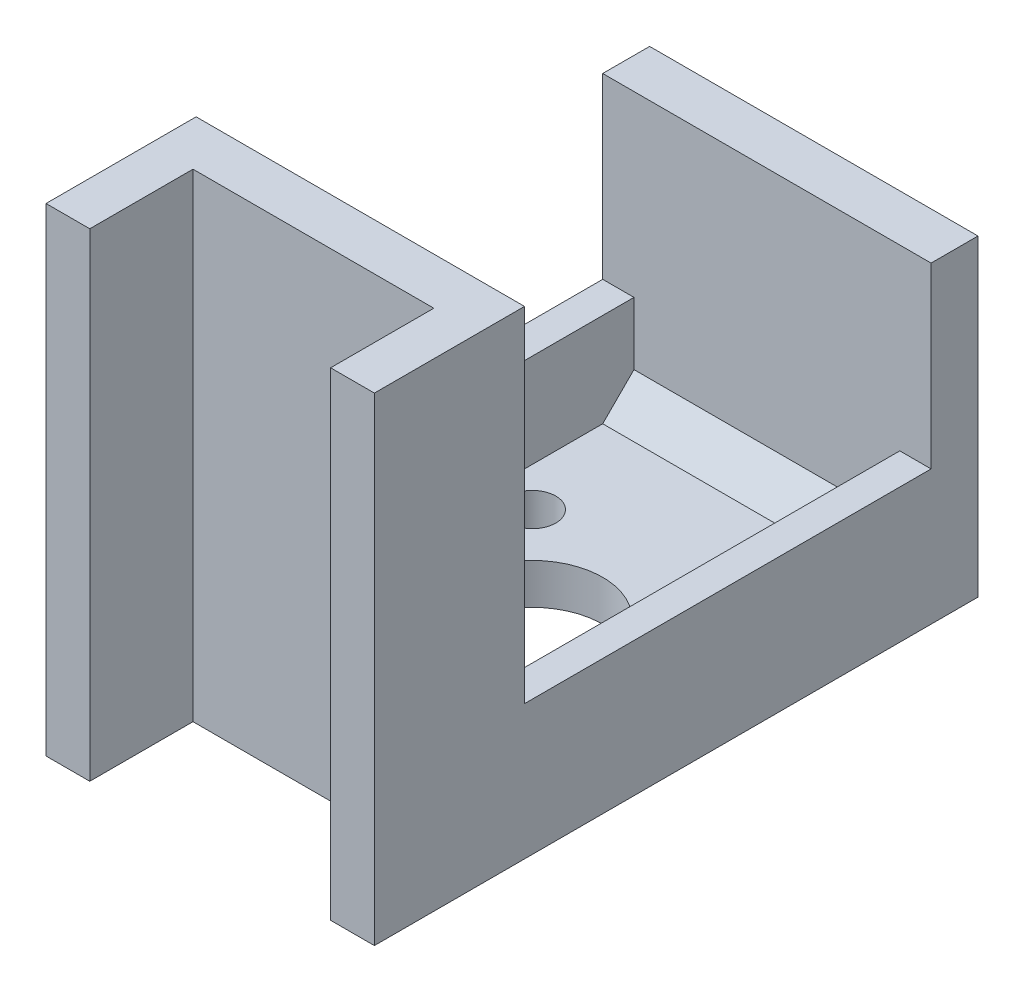
ISO-10303-21;
HEADER;
FILE_DESCRIPTION(('STEP AP214'),'2;1');
FILE_NAME('part.step','',(''),(''),'','','');
FILE_SCHEMA(('AUTOMOTIVE_DESIGN { 1 0 10303 214 1 1 1 1 }'));
ENDSEC;
DATA;
#1=APPLICATION_CONTEXT('core data for automotive mechanical design processes');
#2=APPLICATION_PROTOCOL_DEFINITION('international standard','automotive_design',2000,#1);
#3=PRODUCT_CONTEXT('',#1,'mechanical');
#4=PRODUCT('Part','Part','',(#3));
#5=PRODUCT_RELATED_PRODUCT_CATEGORY('part','',(#4));
#6=PRODUCT_DEFINITION_FORMATION('','',#4);
#7=PRODUCT_DEFINITION_CONTEXT('part definition',#1,'design');
#8=PRODUCT_DEFINITION('design','',#6,#7);
#9=PRODUCT_DEFINITION_SHAPE('','',#8);
#10=(LENGTH_UNIT() NAMED_UNIT(*) SI_UNIT(.MILLI.,.METRE.));
#11=(NAMED_UNIT(*) PLANE_ANGLE_UNIT() SI_UNIT($,.RADIAN.));
#12=(NAMED_UNIT(*) SI_UNIT($,.STERADIAN.) SOLID_ANGLE_UNIT());
#13=UNCERTAINTY_MEASURE_WITH_UNIT(LENGTH_MEASURE(1.E-05),#10,'distance_accuracy_value','');
#14=(GEOMETRIC_REPRESENTATION_CONTEXT(3) GLOBAL_UNCERTAINTY_ASSIGNED_CONTEXT((#13)) GLOBAL_UNIT_ASSIGNED_CONTEXT((#10,
#11,#12)) REPRESENTATION_CONTEXT('',''));
#15=CARTESIAN_POINT('',(0.,0.,0.));
#16=DIRECTION('',(0.,0.,1.));
#17=DIRECTION('',(1.,0.,0.));
#18=AXIS2_PLACEMENT_3D('',#15,#16,#17);
#19=CARTESIAN_POINT('',(0.,1.3,0.));
#20=DIRECTION('',(0.,1.,0.));
#21=DIRECTION('',(0.,0.,1.));
#22=AXIS2_PLACEMENT_3D('',#19,#20,#21);
#23=PLANE('',#22);
#24=CARTESIAN_POINT('',(3.,1.3,3.));
#25=DIRECTION('',(0.,1.,0.));
#26=DIRECTION('',(0.,0.,1.));
#27=AXIS2_PLACEMENT_3D('',#24,#25,#26);
#28=CIRCLE('',#27,0.75);
#29=CARTESIAN_POINT('',(3.,1.3,3.75));
#30=VERTEX_POINT('',#29);
#31=EDGE_CURVE('E284',#30,#30,#28,.T.);
#32=ORIENTED_EDGE('',*,*,#31,.F.);
#33=EDGE_LOOP('',(#32));
#34=FACE_BOUND('',#33,.T.);
#35=CARTESIAN_POINT('',(3.,1.3,-3.));
#36=DIRECTION('',(0.,1.,0.));
#37=DIRECTION('',(0.,0.,1.));
#38=AXIS2_PLACEMENT_3D('',#35,#36,#37);
#39=CIRCLE('',#38,0.75);
#40=CARTESIAN_POINT('',(3.,1.3,-2.25));
#41=VERTEX_POINT('',#40);
#42=EDGE_CURVE('E296',#41,#41,#39,.T.);
#43=ORIENTED_EDGE('',*,*,#42,.F.);
#44=EDGE_LOOP('',(#43));
#45=FACE_BOUND('',#44,.T.);
#46=CARTESIAN_POINT('',(-3.,1.3,-3.));
#47=DIRECTION('',(0.,1.,0.));
#48=DIRECTION('',(0.,0.,1.));
#49=AXIS2_PLACEMENT_3D('',#46,#47,#48);
#50=CIRCLE('',#49,0.75);
#51=CARTESIAN_POINT('',(-3.,1.3,-2.25));
#52=VERTEX_POINT('',#51);
#53=EDGE_CURVE('E302',#52,#52,#50,.T.);
#54=ORIENTED_EDGE('',*,*,#53,.F.);
#55=EDGE_LOOP('',(#54));
#56=FACE_BOUND('',#55,.T.);
#57=CARTESIAN_POINT('',(-3.,1.3,3.));
#58=DIRECTION('',(0.,1.,0.));
#59=DIRECTION('',(0.,0.,1.));
#60=AXIS2_PLACEMENT_3D('',#57,#58,#59);
#61=CIRCLE('',#60,0.75);
#62=CARTESIAN_POINT('',(-3.,1.3,3.75));
#63=VERTEX_POINT('',#62);
#64=EDGE_CURVE('E290',#63,#63,#61,.T.);
#65=ORIENTED_EDGE('',*,*,#64,.F.);
#66=EDGE_LOOP('',(#65));
#67=FACE_BOUND('',#66,.T.);
#68=CARTESIAN_POINT('',(0.,1.3,0.));
#69=DIRECTION('',(0.,1.,0.));
#70=DIRECTION('',(0.,0.,1.));
#71=AXIS2_PLACEMENT_3D('',#68,#69,#70);
#72=CIRCLE('',#71,2.25);
#73=CARTESIAN_POINT('',(0.,1.3,2.25));
#74=VERTEX_POINT('',#73);
#75=EDGE_CURVE('E278',#74,#74,#72,.T.);
#76=ORIENTED_EDGE('',*,*,#75,.F.);
#77=EDGE_LOOP('',(#76));
#78=FACE_BOUND('',#77,.T.);
#79=DIRECTION('',(0.,0.,1.));
#80=VECTOR('',#79,1.);
#81=CARTESIAN_POINT('',(4.25,1.3,5.5));
#82=LINE('',#81,#80);
#83=CARTESIAN_POINT('',(4.25,1.3,-6.50000000000001));
#84=VERTEX_POINT('',#83);
#85=CARTESIAN_POINT('',(4.25,1.3,5.5));
#86=VERTEX_POINT('',#85);
#87=EDGE_CURVE('E193',#84,#86,#82,.T.);
#88=ORIENTED_EDGE('',*,*,#87,.F.);
#89=DIRECTION('',(-1.,0.,0.));
#90=VECTOR('',#89,1.);
#91=CARTESIAN_POINT('',(-4.25,1.3,-6.50000000000001));
#92=LINE('',#91,#90);
#93=CARTESIAN_POINT('',(-4.25,1.3,-6.50000000000001));
#94=VERTEX_POINT('',#93);
#95=EDGE_CURVE('E56',#84,#94,#92,.T.);
#96=ORIENTED_EDGE('',*,*,#95,.T.);
#97=DIRECTION('',(0.,0.,-1.));
#98=VECTOR('',#97,1.);
#99=CARTESIAN_POINT('',(-4.25,1.3,5.5));
#100=LINE('',#99,#98);
#101=CARTESIAN_POINT('',(-4.25,1.3,5.5));
#102=VERTEX_POINT('',#101);
#103=EDGE_CURVE('E195',#102,#94,#100,.T.);
#104=ORIENTED_EDGE('',*,*,#103,.F.);
#105=DIRECTION('',(-1.,0.,0.));
#106=VECTOR('',#105,1.);
#107=CARTESIAN_POINT('',(-5.25,1.3,5.5));
#108=LINE('',#107,#106);
#109=EDGE_CURVE('E256',#86,#102,#108,.T.);
#110=ORIENTED_EDGE('',*,*,#109,.F.);
#111=EDGE_LOOP('',(#88,#96,#104,#110));
#112=FACE_BOUND('',#111,.T.);
#113=ADVANCED_FACE('F47',(#34,#45,#56,#67,#78,#112),#23,.T.);
#114=CARTESIAN_POINT('',(-5.25,15.3,5.5));
#115=DIRECTION('',(0.,0.,1.));
#116=DIRECTION('',(1.,0.,0.));
#117=AXIS2_PLACEMENT_3D('',#114,#115,#116);
#118=PLANE('',#117);
#119=DIRECTION('',(0.,-1.,0.));
#120=VECTOR('',#119,1.);
#121=CARTESIAN_POINT('',(-4.25,4.3,5.5));
#122=LINE('',#121,#120);
#123=CARTESIAN_POINT('',(-4.25,4.3,5.5));
#124=VERTEX_POINT('',#123);
#125=EDGE_CURVE('E370',#124,#102,#122,.T.);
#126=ORIENTED_EDGE('',*,*,#125,.F.);
#127=DIRECTION('',(1.,0.,0.));
#128=VECTOR('',#127,1.);
#129=CARTESIAN_POINT('',(-5.25,4.3,5.5));
#130=LINE('',#129,#128);
#131=CARTESIAN_POINT('',(-5.25,4.3,5.5));
#132=VERTEX_POINT('',#131);
#133=EDGE_CURVE('E359',#132,#124,#130,.T.);
#134=ORIENTED_EDGE('',*,*,#133,.F.);
#135=DIRECTION('',(0.,-1.,0.));
#136=VECTOR('',#135,1.);
#137=CARTESIAN_POINT('',(-5.25,15.3,5.5));
#138=LINE('',#137,#136);
#139=CARTESIAN_POINT('',(-5.25,15.3,5.5));
#140=VERTEX_POINT('',#139);
#141=EDGE_CURVE('E270',#140,#132,#138,.T.);
#142=ORIENTED_EDGE('',*,*,#141,.F.);
#143=DIRECTION('',(-1.,0.,0.));
#144=VECTOR('',#143,1.);
#145=CARTESIAN_POINT('',(-5.25,15.3,5.5));
#146=LINE('',#145,#144);
#147=CARTESIAN_POINT('',(5.25,15.3,5.5));
#148=VERTEX_POINT('',#147);
#149=EDGE_CURVE('E263',#148,#140,#146,.T.);
#150=ORIENTED_EDGE('',*,*,#149,.F.);
#151=DIRECTION('',(0.,-1.,0.));
#152=VECTOR('',#151,1.);
#153=CARTESIAN_POINT('',(5.25,15.3,5.5));
#154=LINE('',#153,#152);
#155=CARTESIAN_POINT('',(5.25,4.3,5.5));
#156=VERTEX_POINT('',#155);
#157=EDGE_CURVE('E275',#148,#156,#154,.T.);
#158=ORIENTED_EDGE('',*,*,#157,.T.);
#159=DIRECTION('',(1.,0.,0.));
#160=VECTOR('',#159,1.);
#161=CARTESIAN_POINT('',(5.25,4.3,5.5));
#162=LINE('',#161,#160);
#163=CARTESIAN_POINT('',(4.25,4.3,5.5));
#164=VERTEX_POINT('',#163);
#165=EDGE_CURVE('E188',#164,#156,#162,.T.);
#166=ORIENTED_EDGE('',*,*,#165,.F.);
#167=DIRECTION('',(0.,-1.,0.));
#168=VECTOR('',#167,1.);
#169=CARTESIAN_POINT('',(4.25,4.3,5.5));
#170=LINE('',#169,#168);
#171=EDGE_CURVE('E174',#164,#86,#170,.T.);
#172=ORIENTED_EDGE('',*,*,#171,.T.);
#173=ORIENTED_EDGE('',*,*,#109,.T.);
#174=EDGE_LOOP('',(#126,#134,#142,#150,#158,#166,#172,#173));
#175=FACE_BOUND('',#174,.T.);
#176=ADVANCED_FACE('F378',(#175),#118,.F.);
#177=CARTESIAN_POINT('',(-5.25,10.,-7.5));
#178=DIRECTION('',(0.,0.,1.));
#179=DIRECTION('',(1.,0.,0.));
#180=AXIS2_PLACEMENT_3D('',#177,#178,#179);
#181=PLANE('',#180);
#182=DIRECTION('',(0.,-1.,0.));
#183=VECTOR('',#182,1.);
#184=CARTESIAN_POINT('',(-4.25,4.3,-7.5));
#185=LINE('',#184,#183);
#186=CARTESIAN_POINT('',(-4.25,4.3,-7.5));
#187=VERTEX_POINT('',#186);
#188=CARTESIAN_POINT('',(-4.25,2.30000000000001,-7.5));
#189=VERTEX_POINT('',#188);
#190=EDGE_CURVE('E367',#187,#189,#185,.T.);
#191=ORIENTED_EDGE('',*,*,#190,.T.);
#192=DIRECTION('',(1.,0.,0.));
#193=VECTOR('',#192,1.);
#194=CARTESIAN_POINT('',(4.25,2.30000000000001,-7.5));
#195=LINE('',#194,#193);
#196=CARTESIAN_POINT('',(4.25,2.30000000000001,-7.5));
#197=VERTEX_POINT('',#196);
#198=EDGE_CURVE('E171',#189,#197,#195,.T.);
#199=ORIENTED_EDGE('',*,*,#198,.T.);
#200=DIRECTION('',(0.,-1.,0.));
#201=VECTOR('',#200,1.);
#202=CARTESIAN_POINT('',(4.25,4.3,-7.5));
#203=LINE('',#202,#201);
#204=CARTESIAN_POINT('',(4.25,4.3,-7.5));
#205=VERTEX_POINT('',#204);
#206=EDGE_CURVE('E164',#205,#197,#203,.T.);
#207=ORIENTED_EDGE('',*,*,#206,.F.);
#208=DIRECTION('',(-1.,0.,0.));
#209=VECTOR('',#208,1.);
#210=CARTESIAN_POINT('',(5.25,4.3,-7.5));
#211=LINE('',#210,#209);
#212=CARTESIAN_POINT('',(5.25,4.3,-7.5));
#213=VERTEX_POINT('',#212);
#214=EDGE_CURVE('E168',#213,#205,#211,.T.);
#215=ORIENTED_EDGE('',*,*,#214,.F.);
#216=DIRECTION('',(0.,-1.,0.));
#217=VECTOR('',#216,1.);
#218=CARTESIAN_POINT('',(5.25,10.,-7.5));
#219=LINE('',#218,#217);
#220=CARTESIAN_POINT('',(5.25,10.,-7.5));
#221=VERTEX_POINT('',#220);
#222=EDGE_CURVE('E215',#221,#213,#219,.T.);
#223=ORIENTED_EDGE('',*,*,#222,.F.);
#224=DIRECTION('',(-1.,0.,0.));
#225=VECTOR('',#224,1.);
#226=CARTESIAN_POINT('',(-5.25,10.,-7.5));
#227=LINE('',#226,#225);
#228=CARTESIAN_POINT('',(-5.25,10.,-7.5));
#229=VERTEX_POINT('',#228);
#230=EDGE_CURVE('E206',#221,#229,#227,.T.);
#231=ORIENTED_EDGE('',*,*,#230,.T.);
#232=DIRECTION('',(0.,-1.,0.));
#233=VECTOR('',#232,1.);
#234=CARTESIAN_POINT('',(-5.25,10.,-7.5));
#235=LINE('',#234,#233);
#236=CARTESIAN_POINT('',(-5.25,4.3,-7.5));
#237=VERTEX_POINT('',#236);
#238=EDGE_CURVE('E212',#229,#237,#235,.T.);
#239=ORIENTED_EDGE('',*,*,#238,.T.);
#240=DIRECTION('',(-1.,0.,0.));
#241=VECTOR('',#240,1.);
#242=CARTESIAN_POINT('',(-5.25,4.3,-7.5));
#243=LINE('',#242,#241);
#244=EDGE_CURVE('E365',#187,#237,#243,.T.);
#245=ORIENTED_EDGE('',*,*,#244,.F.);
#246=EDGE_LOOP('',(#191,#199,#207,#215,#223,#231,#239,#245));
#247=FACE_BOUND('',#246,.T.);
#248=ADVANCED_FACE('F167',(#247),#181,.T.);
#249=CARTESIAN_POINT('',(0.,0.,0.));
#250=DIRECTION('',(0.,1.,0.));
#251=DIRECTION('',(0.,0.,1.));
#252=AXIS2_PLACEMENT_3D('',#249,#250,#251);
#253=PLANE('',#252);
#254=DIRECTION('',(0.,0.,-1.));
#255=VECTOR('',#254,1.);
#256=CARTESIAN_POINT('',(5.25,0.,-7.));
#257=LINE('',#256,#255);
#258=CARTESIAN_POINT('',(5.25,0.,10.3));
#259=VERTEX_POINT('',#258);
#260=CARTESIAN_POINT('',(5.25,0.,-9.));
#261=VERTEX_POINT('',#260);
#262=EDGE_CURVE('E305',#259,#261,#257,.T.);
#263=ORIENTED_EDGE('',*,*,#262,.F.);
#264=DIRECTION('',(-1.,0.,0.));
#265=VECTOR('',#264,1.);
#266=CARTESIAN_POINT('',(5.25,0.,10.3));
#267=LINE('',#266,#265);
#268=CARTESIAN_POINT('',(3.85,0.,10.3));
#269=VERTEX_POINT('',#268);
#270=EDGE_CURVE('E234',#259,#269,#267,.T.);
#271=ORIENTED_EDGE('',*,*,#270,.T.);
#272=DIRECTION('',(0.,0.,-1.));
#273=VECTOR('',#272,1.);
#274=CARTESIAN_POINT('',(3.85,0.,7.));
#275=LINE('',#274,#273);
#276=CARTESIAN_POINT('',(3.85,0.,7.));
#277=VERTEX_POINT('',#276);
#278=EDGE_CURVE('E233',#269,#277,#275,.T.);
#279=ORIENTED_EDGE('',*,*,#278,.T.);
#280=DIRECTION('',(1.,0.,0.));
#281=VECTOR('',#280,1.);
#282=CARTESIAN_POINT('',(-5.25,0.,7.));
#283=LINE('',#282,#281);
#284=CARTESIAN_POINT('',(-3.85,0.,7.));
#285=VERTEX_POINT('',#284);
#286=EDGE_CURVE('E311',#285,#277,#283,.T.);
#287=ORIENTED_EDGE('',*,*,#286,.F.);
#288=DIRECTION('',(0.,0.,1.));
#289=VECTOR('',#288,1.);
#290=CARTESIAN_POINT('',(-3.85,0.,7.));
#291=LINE('',#290,#289);
#292=CARTESIAN_POINT('',(-3.85,0.,10.3));
#293=VERTEX_POINT('',#292);
#294=EDGE_CURVE('E237',#285,#293,#291,.T.);
#295=ORIENTED_EDGE('',*,*,#294,.T.);
#296=DIRECTION('',(-1.,0.,0.));
#297=VECTOR('',#296,1.);
#298=CARTESIAN_POINT('',(-5.25,0.,10.3));
#299=LINE('',#298,#297);
#300=CARTESIAN_POINT('',(-5.25,0.,10.3));
#301=VERTEX_POINT('',#300);
#302=EDGE_CURVE('E240',#293,#301,#299,.T.);
#303=ORIENTED_EDGE('',*,*,#302,.T.);
#304=DIRECTION('',(0.,0.,1.));
#305=VECTOR('',#304,1.);
#306=CARTESIAN_POINT('',(-5.25,0.,-7.));
#307=LINE('',#306,#305);
#308=CARTESIAN_POINT('',(-5.25,0.,-9.));
#309=VERTEX_POINT('',#308);
#310=EDGE_CURVE('E309',#309,#301,#307,.T.);
#311=ORIENTED_EDGE('',*,*,#310,.F.);
#312=DIRECTION('',(1.,0.,0.));
#313=VECTOR('',#312,1.);
#314=CARTESIAN_POINT('',(-5.25,0.,-9.));
#315=LINE('',#314,#313);
#316=EDGE_CURVE('E173',#309,#261,#315,.T.);
#317=ORIENTED_EDGE('',*,*,#316,.T.);
#318=EDGE_LOOP('',(#263,#271,#279,#287,#295,#303,#311,#317));
#319=FACE_BOUND('',#318,.T.);
#320=CARTESIAN_POINT('',(-3.,0.,-3.));
#321=DIRECTION('',(0.,1.,0.));
#322=DIRECTION('',(0.,0.,1.));
#323=AXIS2_PLACEMENT_3D('',#320,#321,#322);
#324=CIRCLE('',#323,0.75);
#325=CARTESIAN_POINT('',(-3.,0.,-2.25));
#326=VERTEX_POINT('',#325);
#327=EDGE_CURVE('E299',#326,#326,#324,.T.);
#328=ORIENTED_EDGE('',*,*,#327,.T.);
#329=EDGE_LOOP('',(#328));
#330=FACE_BOUND('',#329,.T.);
#331=CARTESIAN_POINT('',(3.,0.,-3.));
#332=DIRECTION('',(0.,1.,0.));
#333=DIRECTION('',(0.,0.,1.));
#334=AXIS2_PLACEMENT_3D('',#331,#332,#333);
#335=CIRCLE('',#334,0.75);
#336=CARTESIAN_POINT('',(3.,0.,-2.25));
#337=VERTEX_POINT('',#336);
#338=EDGE_CURVE('E293',#337,#337,#335,.T.);
#339=ORIENTED_EDGE('',*,*,#338,.T.);
#340=EDGE_LOOP('',(#339));
#341=FACE_BOUND('',#340,.T.);
#342=CARTESIAN_POINT('',(-3.,0.,3.));
#343=DIRECTION('',(0.,1.,0.));
#344=DIRECTION('',(0.,0.,1.));
#345=AXIS2_PLACEMENT_3D('',#342,#343,#344);
#346=CIRCLE('',#345,0.75);
#347=CARTESIAN_POINT('',(-3.,0.,3.75));
#348=VERTEX_POINT('',#347);
#349=EDGE_CURVE('E287',#348,#348,#346,.T.);
#350=ORIENTED_EDGE('',*,*,#349,.T.);
#351=EDGE_LOOP('',(#350));
#352=FACE_BOUND('',#351,.T.);
#353=CARTESIAN_POINT('',(3.,0.,3.));
#354=DIRECTION('',(0.,1.,0.));
#355=DIRECTION('',(0.,0.,1.));
#356=AXIS2_PLACEMENT_3D('',#353,#354,#355);
#357=CIRCLE('',#356,0.75);
#358=CARTESIAN_POINT('',(3.,0.,3.75));
#359=VERTEX_POINT('',#358);
#360=EDGE_CURVE('E281',#359,#359,#357,.T.);
#361=ORIENTED_EDGE('',*,*,#360,.T.);
#362=EDGE_LOOP('',(#361));
#363=FACE_BOUND('',#362,.T.);
#364=CARTESIAN_POINT('',(0.,0.,0.));
#365=DIRECTION('',(0.,1.,0.));
#366=DIRECTION('',(0.,0.,1.));
#367=AXIS2_PLACEMENT_3D('',#364,#365,#366);
#368=CIRCLE('',#367,2.25);
#369=CARTESIAN_POINT('',(0.,0.,2.25));
#370=VERTEX_POINT('',#369);
#371=EDGE_CURVE('E277',#370,#370,#368,.T.);
#372=ORIENTED_EDGE('',*,*,#371,.T.);
#373=EDGE_LOOP('',(#372));
#374=FACE_BOUND('',#373,.T.);
#375=ADVANCED_FACE('F322',(#319,#330,#341,#352,#363,#374),#253,.F.);
#376=CARTESIAN_POINT('',(5.25,1.3,-7.));
#377=DIRECTION('',(-1.,0.,0.));
#378=DIRECTION('',(0.,0.,1.));
#379=AXIS2_PLACEMENT_3D('',#376,#377,#378);
#380=PLANE('',#379);
#381=ORIENTED_EDGE('',*,*,#262,.T.);
#382=DIRECTION('',(0.,-1.,0.));
#383=VECTOR('',#382,1.);
#384=CARTESIAN_POINT('',(5.25,10.,-9.));
#385=LINE('',#384,#383);
#386=CARTESIAN_POINT('',(5.25,10.,-9.));
#387=VERTEX_POINT('',#386);
#388=EDGE_CURVE('E217',#387,#261,#385,.T.);
#389=ORIENTED_EDGE('',*,*,#388,.F.);
#390=DIRECTION('',(0.,0.,1.));
#391=VECTOR('',#390,1.);
#392=CARTESIAN_POINT('',(5.25,10.,-7.5));
#393=LINE('',#392,#391);
#394=EDGE_CURVE('E203',#387,#221,#393,.T.);
#395=ORIENTED_EDGE('',*,*,#394,.T.);
#396=ORIENTED_EDGE('',*,*,#222,.T.);
#397=DIRECTION('',(0.,0.,-1.));
#398=VECTOR('',#397,1.);
#399=CARTESIAN_POINT('',(5.25,4.3,5.5));
#400=LINE('',#399,#398);
#401=EDGE_CURVE('E184',#156,#213,#400,.T.);
#402=ORIENTED_EDGE('',*,*,#401,.F.);
#403=ORIENTED_EDGE('',*,*,#157,.F.);
#404=DIRECTION('',(0.,0.,-1.));
#405=VECTOR('',#404,1.);
#406=CARTESIAN_POINT('',(5.25,15.3,5.5));
#407=LINE('',#406,#405);
#408=CARTESIAN_POINT('',(5.25,15.3,10.3));
#409=VERTEX_POINT('',#408);
#410=EDGE_CURVE('E260',#409,#148,#407,.T.);
#411=ORIENTED_EDGE('',*,*,#410,.F.);
#412=DIRECTION('',(0.,-1.,0.));
#413=VECTOR('',#412,1.);
#414=CARTESIAN_POINT('',(5.25,18.884689665787,10.3));
#415=LINE('',#414,#413);
#416=EDGE_CURVE('E214',#409,#259,#415,.T.);
#417=ORIENTED_EDGE('',*,*,#416,.T.);
#418=EDGE_LOOP('',(#381,#389,#395,#396,#402,#403,#411,#417));
#419=FACE_BOUND('',#418,.T.);
#420=ADVANCED_FACE('F349',(#419),#380,.F.);
#421=CARTESIAN_POINT('',(-5.25,1.3,-7.));
#422=DIRECTION('',(1.,0.,0.));
#423=DIRECTION('',(0.,0.,-1.));
#424=AXIS2_PLACEMENT_3D('',#421,#422,#423);
#425=PLANE('',#424);
#426=ORIENTED_EDGE('',*,*,#310,.T.);
#427=DIRECTION('',(0.,-1.,0.));
#428=VECTOR('',#427,1.);
#429=CARTESIAN_POINT('',(-5.25,18.884689665787,10.3));
#430=LINE('',#429,#428);
#431=CARTESIAN_POINT('',(-5.25,15.3,10.3));
#432=VERTEX_POINT('',#431);
#433=EDGE_CURVE('E249',#432,#301,#430,.T.);
#434=ORIENTED_EDGE('',*,*,#433,.F.);
#435=DIRECTION('',(0.,0.,1.));
#436=VECTOR('',#435,1.);
#437=CARTESIAN_POINT('',(-5.25,15.3,7.));
#438=LINE('',#437,#436);
#439=EDGE_CURVE('E265',#140,#432,#438,.T.);
#440=ORIENTED_EDGE('',*,*,#439,.F.);
#441=ORIENTED_EDGE('',*,*,#141,.T.);
#442=DIRECTION('',(0.,0.,1.));
#443=VECTOR('',#442,1.);
#444=CARTESIAN_POINT('',(-5.25,4.3,5.5));
#445=LINE('',#444,#443);
#446=EDGE_CURVE('E356',#237,#132,#445,.T.);
#447=ORIENTED_EDGE('',*,*,#446,.F.);
#448=ORIENTED_EDGE('',*,*,#238,.F.);
#449=DIRECTION('',(0.,0.,-1.));
#450=VECTOR('',#449,1.);
#451=CARTESIAN_POINT('',(-5.25,10.,-7.5));
#452=LINE('',#451,#450);
#453=CARTESIAN_POINT('',(-5.25,10.,-9.));
#454=VERTEX_POINT('',#453);
#455=EDGE_CURVE('E197',#229,#454,#452,.T.);
#456=ORIENTED_EDGE('',*,*,#455,.T.);
#457=DIRECTION('',(0.,-1.,0.));
#458=VECTOR('',#457,1.);
#459=CARTESIAN_POINT('',(-5.25,10.,-9.));
#460=LINE('',#459,#458);
#461=EDGE_CURVE('E209',#454,#309,#460,.T.);
#462=ORIENTED_EDGE('',*,*,#461,.T.);
#463=EDGE_LOOP('',(#426,#434,#440,#441,#447,#448,#456,#462));
#464=FACE_BOUND('',#463,.T.);
#465=ADVANCED_FACE('F342',(#464),#425,.F.);
#466=CARTESIAN_POINT('',(-5.25,1.3,7.));
#467=DIRECTION('',(0.,0.,-1.));
#468=DIRECTION('',(-1.,0.,0.));
#469=AXIS2_PLACEMENT_3D('',#466,#467,#468);
#470=PLANE('',#469);
#471=ORIENTED_EDGE('',*,*,#286,.T.);
#472=DIRECTION('',(0.,-1.,0.));
#473=VECTOR('',#472,1.);
#474=CARTESIAN_POINT('',(3.85,18.884689665787,7.));
#475=LINE('',#474,#473);
#476=CARTESIAN_POINT('',(3.85,15.3,7.));
#477=VERTEX_POINT('',#476);
#478=EDGE_CURVE('E224',#477,#277,#475,.T.);
#479=ORIENTED_EDGE('',*,*,#478,.F.);
#480=DIRECTION('',(1.,0.,0.));
#481=VECTOR('',#480,1.);
#482=CARTESIAN_POINT('',(-5.25,15.3,7.));
#483=LINE('',#482,#481);
#484=CARTESIAN_POINT('',(-3.85,15.3,7.));
#485=VERTEX_POINT('',#484);
#486=EDGE_CURVE('E267',#485,#477,#483,.T.);
#487=ORIENTED_EDGE('',*,*,#486,.F.);
#488=DIRECTION('',(0.,-1.,0.));
#489=VECTOR('',#488,1.);
#490=CARTESIAN_POINT('',(-3.85,18.884689665787,7.));
#491=LINE('',#490,#489);
#492=EDGE_CURVE('E243',#485,#285,#491,.T.);
#493=ORIENTED_EDGE('',*,*,#492,.T.);
#494=EDGE_LOOP('',(#471,#479,#487,#493));
#495=FACE_BOUND('',#494,.T.);
#496=ADVANCED_FACE('F318',(#495),#470,.F.);
#497=CARTESIAN_POINT('',(-3.,1.3,-3.));
#498=DIRECTION('',(0.,-1.,0.));
#499=DIRECTION('',(0.,0.,-1.));
#500=AXIS2_PLACEMENT_3D('',#497,#498,#499);
#501=CYLINDRICAL_SURFACE('',#500,0.75);
#502=ORIENTED_EDGE('',*,*,#53,.T.);
#503=EDGE_LOOP('',(#502));
#504=FACE_BOUND('',#503,.T.);
#505=ORIENTED_EDGE('',*,*,#327,.F.);
#506=EDGE_LOOP('',(#505));
#507=FACE_BOUND('',#506,.T.);
#508=ADVANCED_FACE('F407',(#504,#507),#501,.F.);
#509=CARTESIAN_POINT('',(3.,1.3,-3.));
#510=DIRECTION('',(0.,-1.,0.));
#511=DIRECTION('',(0.,0.,-1.));
#512=AXIS2_PLACEMENT_3D('',#509,#510,#511);
#513=CYLINDRICAL_SURFACE('',#512,0.75);
#514=ORIENTED_EDGE('',*,*,#42,.T.);
#515=EDGE_LOOP('',(#514));
#516=FACE_BOUND('',#515,.T.);
#517=ORIENTED_EDGE('',*,*,#338,.F.);
#518=EDGE_LOOP('',(#517));
#519=FACE_BOUND('',#518,.T.);
#520=ADVANCED_FACE('F434',(#516,#519),#513,.F.);
#521=CARTESIAN_POINT('',(-3.,1.3,3.));
#522=DIRECTION('',(0.,-1.,0.));
#523=DIRECTION('',(0.,0.,-1.));
#524=AXIS2_PLACEMENT_3D('',#521,#522,#523);
#525=CYLINDRICAL_SURFACE('',#524,0.75);
#526=ORIENTED_EDGE('',*,*,#64,.T.);
#527=EDGE_LOOP('',(#526));
#528=FACE_BOUND('',#527,.T.);
#529=ORIENTED_EDGE('',*,*,#349,.F.);
#530=EDGE_LOOP('',(#529));
#531=FACE_BOUND('',#530,.T.);
#532=ADVANCED_FACE('F441',(#528,#531),#525,.F.);
#533=CARTESIAN_POINT('',(3.,1.3,3.));
#534=DIRECTION('',(0.,-1.,0.));
#535=DIRECTION('',(0.,0.,-1.));
#536=AXIS2_PLACEMENT_3D('',#533,#534,#535);
#537=CYLINDRICAL_SURFACE('',#536,0.75);
#538=ORIENTED_EDGE('',*,*,#31,.T.);
#539=EDGE_LOOP('',(#538));
#540=FACE_BOUND('',#539,.T.);
#541=ORIENTED_EDGE('',*,*,#360,.F.);
#542=EDGE_LOOP('',(#541));
#543=FACE_BOUND('',#542,.T.);
#544=ADVANCED_FACE('F448',(#540,#543),#537,.F.);
#545=CARTESIAN_POINT('',(0.,1.3,0.));
#546=DIRECTION('',(0.,-1.,0.));
#547=DIRECTION('',(0.,0.,-1.));
#548=AXIS2_PLACEMENT_3D('',#545,#546,#547);
#549=CYLINDRICAL_SURFACE('',#548,2.25);
#550=ORIENTED_EDGE('',*,*,#75,.T.);
#551=EDGE_LOOP('',(#550));
#552=FACE_BOUND('',#551,.T.);
#553=ORIENTED_EDGE('',*,*,#371,.F.);
#554=EDGE_LOOP('',(#553));
#555=FACE_BOUND('',#554,.T.);
#556=ADVANCED_FACE('F456',(#552,#555),#549,.F.);
#557=CARTESIAN_POINT('',(0.,15.3,0.));
#558=DIRECTION('',(0.,1.,0.));
#559=DIRECTION('',(0.,0.,1.));
#560=AXIS2_PLACEMENT_3D('',#557,#558,#559);
#561=PLANE('',#560);
#562=ORIENTED_EDGE('',*,*,#410,.T.);
#563=ORIENTED_EDGE('',*,*,#149,.T.);
#564=ORIENTED_EDGE('',*,*,#439,.T.);
#565=DIRECTION('',(-1.,0.,0.));
#566=VECTOR('',#565,1.);
#567=CARTESIAN_POINT('',(-5.25,15.3,10.3));
#568=LINE('',#567,#566);
#569=CARTESIAN_POINT('',(-3.85,15.3,10.3));
#570=VERTEX_POINT('',#569);
#571=EDGE_CURVE('E246',#570,#432,#568,.T.);
#572=ORIENTED_EDGE('',*,*,#571,.F.);
#573=DIRECTION('',(0.,0.,1.));
#574=VECTOR('',#573,1.);
#575=CARTESIAN_POINT('',(-3.85,15.3,7.));
#576=LINE('',#575,#574);
#577=EDGE_CURVE('E251',#485,#570,#576,.T.);
#578=ORIENTED_EDGE('',*,*,#577,.F.);
#579=ORIENTED_EDGE('',*,*,#486,.T.);
#580=DIRECTION('',(0.,0.,-1.));
#581=VECTOR('',#580,1.);
#582=CARTESIAN_POINT('',(3.85,15.3,7.));
#583=LINE('',#582,#581);
#584=CARTESIAN_POINT('',(3.85,15.3,10.3));
#585=VERTEX_POINT('',#584);
#586=EDGE_CURVE('E228',#585,#477,#583,.T.);
#587=ORIENTED_EDGE('',*,*,#586,.F.);
#588=DIRECTION('',(-1.,0.,0.));
#589=VECTOR('',#588,1.);
#590=CARTESIAN_POINT('',(5.25,15.3,10.3));
#591=LINE('',#590,#589);
#592=EDGE_CURVE('E227',#409,#585,#591,.T.);
#593=ORIENTED_EDGE('',*,*,#592,.F.);
#594=EDGE_LOOP('',(#562,#563,#564,#572,#578,#579,#587,#593));
#595=FACE_BOUND('',#594,.T.);
#596=ADVANCED_FACE('F332',(#595),#561,.T.);
#597=CARTESIAN_POINT('',(-3.85,18.884689665787,7.));
#598=DIRECTION('',(1.,0.,0.));
#599=DIRECTION('',(0.,0.,-1.));
#600=AXIS2_PLACEMENT_3D('',#597,#598,#599);
#601=PLANE('',#600);
#602=ORIENTED_EDGE('',*,*,#492,.F.);
#603=ORIENTED_EDGE('',*,*,#577,.T.);
#604=DIRECTION('',(0.,-1.,0.));
#605=VECTOR('',#604,1.);
#606=CARTESIAN_POINT('',(-3.85,18.884689665787,10.3));
#607=LINE('',#606,#605);
#608=EDGE_CURVE('E250',#570,#293,#607,.T.);
#609=ORIENTED_EDGE('',*,*,#608,.T.);
#610=ORIENTED_EDGE('',*,*,#294,.F.);
#611=EDGE_LOOP('',(#602,#603,#609,#610));
#612=FACE_BOUND('',#611,.T.);
#613=ADVANCED_FACE('F336',(#612),#601,.T.);
#614=CARTESIAN_POINT('',(-5.25,18.884689665787,10.3));
#615=DIRECTION('',(0.,0.,1.));
#616=DIRECTION('',(1.,0.,0.));
#617=AXIS2_PLACEMENT_3D('',#614,#615,#616);
#618=PLANE('',#617);
#619=ORIENTED_EDGE('',*,*,#608,.F.);
#620=ORIENTED_EDGE('',*,*,#571,.T.);
#621=ORIENTED_EDGE('',*,*,#433,.T.);
#622=ORIENTED_EDGE('',*,*,#302,.F.);
#623=EDGE_LOOP('',(#619,#620,#621,#622));
#624=FACE_BOUND('',#623,.T.);
#625=ADVANCED_FACE('F338',(#624),#618,.T.);
#626=CARTESIAN_POINT('',(5.25,18.884689665787,10.3));
#627=DIRECTION('',(0.,0.,1.));
#628=DIRECTION('',(1.,0.,0.));
#629=AXIS2_PLACEMENT_3D('',#626,#627,#628);
#630=PLANE('',#629);
#631=ORIENTED_EDGE('',*,*,#416,.F.);
#632=ORIENTED_EDGE('',*,*,#592,.T.);
#633=DIRECTION('',(0.,-1.,0.));
#634=VECTOR('',#633,1.);
#635=CARTESIAN_POINT('',(3.85,18.884689665787,10.3));
#636=LINE('',#635,#634);
#637=EDGE_CURVE('E225',#585,#269,#636,.T.);
#638=ORIENTED_EDGE('',*,*,#637,.T.);
#639=ORIENTED_EDGE('',*,*,#270,.F.);
#640=EDGE_LOOP('',(#631,#632,#638,#639));
#641=FACE_BOUND('',#640,.T.);
#642=ADVANCED_FACE('F386',(#641),#630,.T.);
#643=CARTESIAN_POINT('',(3.85,18.884689665787,7.));
#644=DIRECTION('',(-1.,0.,0.));
#645=DIRECTION('',(0.,0.,1.));
#646=AXIS2_PLACEMENT_3D('',#643,#644,#645);
#647=PLANE('',#646);
#648=ORIENTED_EDGE('',*,*,#637,.F.);
#649=ORIENTED_EDGE('',*,*,#586,.T.);
#650=ORIENTED_EDGE('',*,*,#478,.T.);
#651=ORIENTED_EDGE('',*,*,#278,.F.);
#652=EDGE_LOOP('',(#648,#649,#650,#651));
#653=FACE_BOUND('',#652,.T.);
#654=ADVANCED_FACE('F329',(#653),#647,.T.);
#655=CARTESIAN_POINT('',(-5.25,10.,-9.));
#656=DIRECTION('',(0.,0.,-1.));
#657=DIRECTION('',(-1.,0.,0.));
#658=AXIS2_PLACEMENT_3D('',#655,#656,#657);
#659=PLANE('',#658);
#660=ORIENTED_EDGE('',*,*,#316,.F.);
#661=ORIENTED_EDGE('',*,*,#461,.F.);
#662=DIRECTION('',(1.,0.,0.));
#663=VECTOR('',#662,1.);
#664=CARTESIAN_POINT('',(-5.25,10.,-9.));
#665=LINE('',#664,#663);
#666=EDGE_CURVE('E200',#454,#387,#665,.T.);
#667=ORIENTED_EDGE('',*,*,#666,.T.);
#668=ORIENTED_EDGE('',*,*,#388,.T.);
#669=EDGE_LOOP('',(#660,#661,#667,#668));
#670=FACE_BOUND('',#669,.T.);
#671=ADVANCED_FACE('F346',(#670),#659,.T.);
#672=CARTESIAN_POINT('',(0.,10.,0.));
#673=DIRECTION('',(0.,-1.,0.));
#674=DIRECTION('',(0.,0.,-1.));
#675=AXIS2_PLACEMENT_3D('',#672,#673,#674);
#676=PLANE('',#675);
#677=ORIENTED_EDGE('',*,*,#455,.F.);
#678=ORIENTED_EDGE('',*,*,#230,.F.);
#679=ORIENTED_EDGE('',*,*,#394,.F.);
#680=ORIENTED_EDGE('',*,*,#666,.F.);
#681=EDGE_LOOP('',(#677,#678,#679,#680));
#682=FACE_BOUND('',#681,.T.);
#683=ADVANCED_FACE('F352',(#682),#676,.F.);
#684=CARTESIAN_POINT('',(4.25,4.3,5.5));
#685=DIRECTION('',(1.,0.,0.));
#686=DIRECTION('',(0.,0.,-1.));
#687=AXIS2_PLACEMENT_3D('',#684,#685,#686);
#688=PLANE('',#687);
#689=ORIENTED_EDGE('',*,*,#206,.T.);
#690=DIRECTION('',(0.,0.707106781186552,-0.707106781186543));
#691=VECTOR('',#690,1.);
#692=CARTESIAN_POINT('',(4.25,2.30000000000001,-7.5));
#693=LINE('',#692,#691);
#694=EDGE_CURVE('E70',#197,#84,#693,.F.);
#695=ORIENTED_EDGE('',*,*,#694,.T.);
#696=ORIENTED_EDGE('',*,*,#87,.T.);
#697=ORIENTED_EDGE('',*,*,#171,.F.);
#698=DIRECTION('',(0.,0.,1.));
#699=VECTOR('',#698,1.);
#700=CARTESIAN_POINT('',(4.25,4.3,5.5));
#701=LINE('',#700,#699);
#702=EDGE_CURVE('E181',#205,#164,#701,.T.);
#703=ORIENTED_EDGE('',*,*,#702,.F.);
#704=EDGE_LOOP('',(#689,#695,#696,#697,#703));
#705=FACE_BOUND('',#704,.T.);
#706=ADVANCED_FACE('F186',(#705),#688,.F.);
#707=CARTESIAN_POINT('',(0.,4.3,0.));
#708=DIRECTION('',(0.,1.,0.));
#709=DIRECTION('',(0.,0.,1.));
#710=AXIS2_PLACEMENT_3D('',#707,#708,#709);
#711=PLANE('',#710);
#712=ORIENTED_EDGE('',*,*,#401,.T.);
#713=ORIENTED_EDGE('',*,*,#214,.T.);
#714=ORIENTED_EDGE('',*,*,#702,.T.);
#715=ORIENTED_EDGE('',*,*,#165,.T.);
#716=EDGE_LOOP('',(#712,#713,#714,#715));
#717=FACE_BOUND('',#716,.T.);
#718=ADVANCED_FACE('F179',(#717),#711,.T.);
#719=CARTESIAN_POINT('',(-4.25,4.3,5.5));
#720=DIRECTION('',(-1.,0.,0.));
#721=DIRECTION('',(0.,0.,1.));
#722=AXIS2_PLACEMENT_3D('',#719,#720,#721);
#723=PLANE('',#722);
#724=ORIENTED_EDGE('',*,*,#103,.T.);
#725=DIRECTION('',(0.,-0.707106781186552,0.707106781186543));
#726=VECTOR('',#725,1.);
#727=CARTESIAN_POINT('',(-4.25,2.30000000000001,-7.5));
#728=LINE('',#727,#726);
#729=EDGE_CURVE('E11',#94,#189,#728,.F.);
#730=ORIENTED_EDGE('',*,*,#729,.T.);
#731=ORIENTED_EDGE('',*,*,#190,.F.);
#732=DIRECTION('',(0.,0.,-1.));
#733=VECTOR('',#732,1.);
#734=CARTESIAN_POINT('',(-4.25,4.3,5.5));
#735=LINE('',#734,#733);
#736=EDGE_CURVE('E362',#124,#187,#735,.T.);
#737=ORIENTED_EDGE('',*,*,#736,.F.);
#738=ORIENTED_EDGE('',*,*,#125,.T.);
#739=EDGE_LOOP('',(#724,#730,#731,#737,#738));
#740=FACE_BOUND('',#739,.T.);
#741=ADVANCED_FACE('F374',(#740),#723,.F.);
#742=CARTESIAN_POINT('',(0.,4.3,0.));
#743=DIRECTION('',(0.,-1.,0.));
#744=DIRECTION('',(0.,0.,-1.));
#745=AXIS2_PLACEMENT_3D('',#742,#743,#744);
#746=PLANE('',#745);
#747=ORIENTED_EDGE('',*,*,#446,.T.);
#748=ORIENTED_EDGE('',*,*,#133,.T.);
#749=ORIENTED_EDGE('',*,*,#736,.T.);
#750=ORIENTED_EDGE('',*,*,#244,.T.);
#751=EDGE_LOOP('',(#747,#748,#749,#750));
#752=FACE_BOUND('',#751,.T.);
#753=ADVANCED_FACE('F382',(#752),#746,.F.);
#754=CARTESIAN_POINT('',(-5.25,2.30000000000001,-7.5));
#755=DIRECTION('',(0.,0.707106781186543,0.707106781186552));
#756=DIRECTION('',(-1.,0.,0.));
#757=AXIS2_PLACEMENT_3D('',#754,#755,#756);
#758=PLANE('',#757);
#759=ORIENTED_EDGE('',*,*,#729,.F.);
#760=ORIENTED_EDGE('',*,*,#95,.F.);
#761=ORIENTED_EDGE('',*,*,#694,.F.);
#762=ORIENTED_EDGE('',*,*,#198,.F.);
#763=EDGE_LOOP('',(#759,#760,#761,#762));
#764=FACE_BOUND('',#763,.T.);
#765=ADVANCED_FACE('F50',(#764),#758,.T.);
#766=CLOSED_SHELL('',(#113,#176,#248,#375,#420,#465,#496,#508,#520,#532,#544,#556,#596,#613,
#625,#642,#654,#671,#683,#706,#718,#741,#753,#765));
#767=MANIFOLD_SOLID_BREP('B2',#766);
#768=ADVANCED_BREP_SHAPE_REPRESENTATION('',(#18,#767),#14);
#769=SHAPE_DEFINITION_REPRESENTATION(#9,#768);
ENDSEC;
END-ISO-10303-21;
